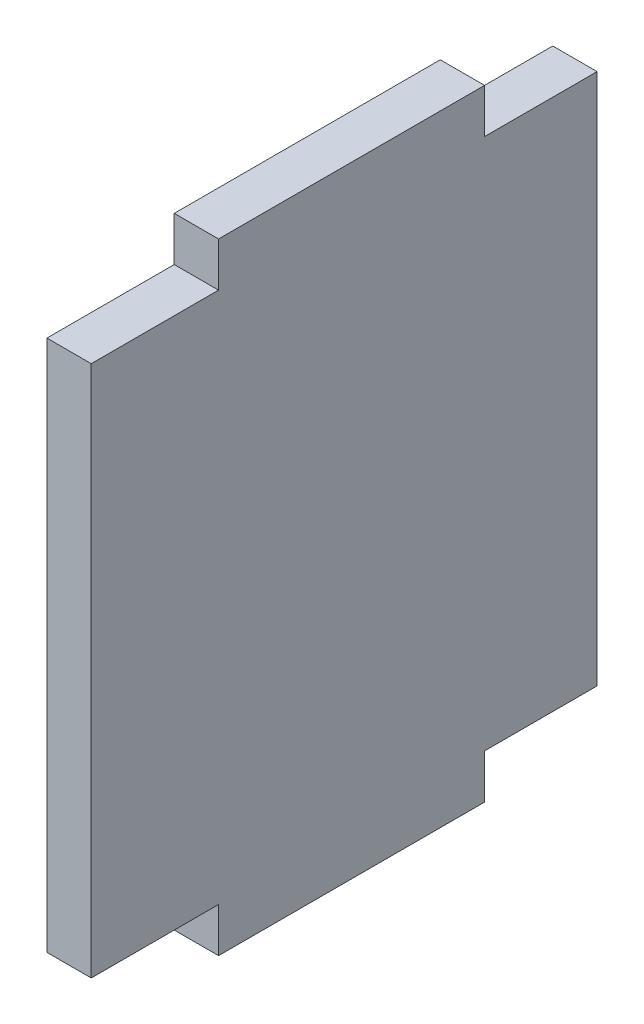
ISO-10303-21;
HEADER;
FILE_DESCRIPTION(('STEP AP214'),'2;1');
FILE_NAME('part.step','',(''),(''),'','','');
FILE_SCHEMA(('AUTOMOTIVE_DESIGN { 1 0 10303 214 1 1 1 1 }'));
ENDSEC;
DATA;
#1=APPLICATION_CONTEXT('core data for automotive mechanical design processes');
#2=APPLICATION_PROTOCOL_DEFINITION('international standard','automotive_design',2000,#1);
#3=PRODUCT_CONTEXT('',#1,'mechanical');
#4=PRODUCT('Part','Part','',(#3));
#5=PRODUCT_RELATED_PRODUCT_CATEGORY('part','',(#4));
#6=PRODUCT_DEFINITION_FORMATION('','',#4);
#7=PRODUCT_DEFINITION_CONTEXT('part definition',#1,'design');
#8=PRODUCT_DEFINITION('design','',#6,#7);
#9=PRODUCT_DEFINITION_SHAPE('','',#8);
#10=(LENGTH_UNIT() NAMED_UNIT(*) SI_UNIT(.MILLI.,.METRE.));
#11=(NAMED_UNIT(*) PLANE_ANGLE_UNIT() SI_UNIT($,.RADIAN.));
#12=(NAMED_UNIT(*) SI_UNIT($,.STERADIAN.) SOLID_ANGLE_UNIT());
#13=UNCERTAINTY_MEASURE_WITH_UNIT(LENGTH_MEASURE(1.E-05),#10,'distance_accuracy_value','');
#14=(GEOMETRIC_REPRESENTATION_CONTEXT(3) GLOBAL_UNCERTAINTY_ASSIGNED_CONTEXT((#13)) GLOBAL_UNIT_ASSIGNED_CONTEXT((#10,
#11,#12)) REPRESENTATION_CONTEXT('',''));
#15=CARTESIAN_POINT('',(0.,0.,0.));
#16=DIRECTION('',(0.,0.,1.));
#17=DIRECTION('',(1.,0.,0.));
#18=AXIS2_PLACEMENT_3D('',#15,#16,#17);
#19=CARTESIAN_POINT('',(1.25,15.,-6.85046433));
#20=DIRECTION('',(0.,-1.,0.));
#21=DIRECTION('',(0.,0.,-1.));
#22=AXIS2_PLACEMENT_3D('',#19,#20,#21);
#23=PLANE('',#22);
#24=DIRECTION('',(0.,0.,1.));
#25=VECTOR('',#24,1.);
#26=CARTESIAN_POINT('',(-1.25,15.,-6.85046433));
#27=LINE('',#26,#25);
#28=CARTESIAN_POINT('',(-1.25,15.,-13.195));
#29=VERTEX_POINT('',#28);
#30=CARTESIAN_POINT('',(-1.25,15.,-6.85046433));
#31=VERTEX_POINT('',#30);
#32=EDGE_CURVE('E164',#29,#31,#27,.T.);
#33=ORIENTED_EDGE('',*,*,#32,.T.);
#34=DIRECTION('',(-1.,0.,0.));
#35=VECTOR('',#34,1.);
#36=CARTESIAN_POINT('',(1.25,15.,-6.85046433));
#37=LINE('',#36,#35);
#38=CARTESIAN_POINT('',(1.25,15.,-6.85046433));
#39=VERTEX_POINT('',#38);
#40=EDGE_CURVE('E11',#39,#31,#37,.T.);
#41=ORIENTED_EDGE('',*,*,#40,.F.);
#42=DIRECTION('',(0.,0.,1.));
#43=VECTOR('',#42,1.);
#44=CARTESIAN_POINT('',(1.25,15.,-6.85046433));
#45=LINE('',#44,#43);
#46=CARTESIAN_POINT('',(1.25,15.,-13.195));
#47=VERTEX_POINT('',#46);
#48=EDGE_CURVE('E198',#47,#39,#45,.T.);
#49=ORIENTED_EDGE('',*,*,#48,.F.);
#50=DIRECTION('',(-1.,0.,0.));
#51=VECTOR('',#50,1.);
#52=CARTESIAN_POINT('',(1.25,15.,-13.195));
#53=LINE('',#52,#51);
#54=EDGE_CURVE('E160',#47,#29,#53,.T.);
#55=ORIENTED_EDGE('',*,*,#54,.T.);
#56=EDGE_LOOP('',(#33,#41,#49,#55));
#57=FACE_BOUND('',#56,.T.);
#58=ADVANCED_FACE('F39',(#57),#23,.F.);
#59=CARTESIAN_POINT('',(1.25,17.5,-6.85046433));
#60=DIRECTION('',(0.,0.,1.));
#61=DIRECTION('',(1.,0.,0.));
#62=AXIS2_PLACEMENT_3D('',#59,#60,#61);
#63=PLANE('',#62);
#64=DIRECTION('',(0.,1.,0.));
#65=VECTOR('',#64,1.);
#66=CARTESIAN_POINT('',(-1.25,17.5,-6.85046433));
#67=LINE('',#66,#65);
#68=CARTESIAN_POINT('',(-1.25,17.5,-6.85046433));
#69=VERTEX_POINT('',#68);
#70=EDGE_CURVE('E168',#31,#69,#67,.T.);
#71=ORIENTED_EDGE('',*,*,#70,.T.);
#72=DIRECTION('',(-1.,0.,0.));
#73=VECTOR('',#72,1.);
#74=CARTESIAN_POINT('',(1.25,17.5,-6.85046433));
#75=LINE('',#74,#73);
#76=CARTESIAN_POINT('',(1.25,17.5,-6.85046433));
#77=VERTEX_POINT('',#76);
#78=EDGE_CURVE('E48',#77,#69,#75,.T.);
#79=ORIENTED_EDGE('',*,*,#78,.F.);
#80=DIRECTION('',(0.,1.,0.));
#81=VECTOR('',#80,1.);
#82=CARTESIAN_POINT('',(1.25,17.5,-6.85046433));
#83=LINE('',#82,#81);
#84=EDGE_CURVE('E111',#39,#77,#83,.T.);
#85=ORIENTED_EDGE('',*,*,#84,.F.);
#86=ORIENTED_EDGE('',*,*,#40,.T.);
#87=EDGE_LOOP('',(#71,#79,#85,#86));
#88=FACE_BOUND('',#87,.T.);
#89=ADVANCED_FACE('F292',(#88),#63,.F.);
#90=CARTESIAN_POINT('',(1.25,17.5,8.14953567));
#91=DIRECTION('',(0.,-1.,0.));
#92=DIRECTION('',(0.,0.,-1.));
#93=AXIS2_PLACEMENT_3D('',#90,#91,#92);
#94=PLANE('',#93);
#95=DIRECTION('',(0.,0.,1.));
#96=VECTOR('',#95,1.);
#97=CARTESIAN_POINT('',(-1.25,17.5,8.14953567));
#98=LINE('',#97,#96);
#99=CARTESIAN_POINT('',(-1.25,17.5,8.14953567));
#100=VERTEX_POINT('',#99);
#101=EDGE_CURVE('E171',#69,#100,#98,.T.);
#102=ORIENTED_EDGE('',*,*,#101,.T.);
#103=DIRECTION('',(-1.,0.,0.));
#104=VECTOR('',#103,1.);
#105=CARTESIAN_POINT('',(1.25,17.5,8.14953567));
#106=LINE('',#105,#104);
#107=CARTESIAN_POINT('',(1.25,17.5,8.14953567));
#108=VERTEX_POINT('',#107);
#109=EDGE_CURVE('E225',#108,#100,#106,.T.);
#110=ORIENTED_EDGE('',*,*,#109,.F.);
#111=DIRECTION('',(0.,0.,1.));
#112=VECTOR('',#111,1.);
#113=CARTESIAN_POINT('',(1.25,17.5,8.14953567));
#114=LINE('',#113,#112);
#115=EDGE_CURVE('E235',#77,#108,#114,.T.);
#116=ORIENTED_EDGE('',*,*,#115,.F.);
#117=ORIENTED_EDGE('',*,*,#78,.T.);
#118=EDGE_LOOP('',(#102,#110,#116,#117));
#119=FACE_BOUND('',#118,.T.);
#120=ADVANCED_FACE('F233',(#119),#94,.F.);
#121=CARTESIAN_POINT('',(1.25,15.,8.14953567));
#122=DIRECTION('',(0.,0.,-1.));
#123=DIRECTION('',(-1.,0.,0.));
#124=AXIS2_PLACEMENT_3D('',#121,#122,#123);
#125=PLANE('',#124);
#126=DIRECTION('',(0.,-1.,0.));
#127=VECTOR('',#126,1.);
#128=CARTESIAN_POINT('',(-1.25,15.,8.14953567));
#129=LINE('',#128,#127);
#130=CARTESIAN_POINT('',(-1.25,15.,8.14953567));
#131=VERTEX_POINT('',#130);
#132=EDGE_CURVE('E174',#100,#131,#129,.T.);
#133=ORIENTED_EDGE('',*,*,#132,.T.);
#134=DIRECTION('',(-1.,0.,0.));
#135=VECTOR('',#134,1.);
#136=CARTESIAN_POINT('',(1.25,15.,8.14953567));
#137=LINE('',#136,#135);
#138=CARTESIAN_POINT('',(1.25,15.,8.14953567));
#139=VERTEX_POINT('',#138);
#140=EDGE_CURVE('E221',#139,#131,#137,.T.);
#141=ORIENTED_EDGE('',*,*,#140,.F.);
#142=DIRECTION('',(0.,-1.,0.));
#143=VECTOR('',#142,1.);
#144=CARTESIAN_POINT('',(1.25,15.,8.14953567));
#145=LINE('',#144,#143);
#146=EDGE_CURVE('E254',#108,#139,#145,.T.);
#147=ORIENTED_EDGE('',*,*,#146,.F.);
#148=ORIENTED_EDGE('',*,*,#109,.T.);
#149=EDGE_LOOP('',(#133,#141,#147,#148));
#150=FACE_BOUND('',#149,.T.);
#151=ADVANCED_FACE('F244',(#150),#125,.F.);
#152=CARTESIAN_POINT('',(1.25,15.,8.14953567));
#153=DIRECTION('',(0.,-1.,0.));
#154=DIRECTION('',(0.,0.,-1.));
#155=AXIS2_PLACEMENT_3D('',#152,#153,#154);
#156=PLANE('',#155);
#157=DIRECTION('',(0.,0.,1.));
#158=VECTOR('',#157,1.);
#159=CARTESIAN_POINT('',(-1.25,15.,8.14953567));
#160=LINE('',#159,#158);
#161=CARTESIAN_POINT('',(-1.25,15.,15.32953567));
#162=VERTEX_POINT('',#161);
#163=EDGE_CURVE('E177',#131,#162,#160,.T.);
#164=ORIENTED_EDGE('',*,*,#163,.T.);
#165=DIRECTION('',(-1.,0.,0.));
#166=VECTOR('',#165,1.);
#167=CARTESIAN_POINT('',(1.25,15.,15.32953567));
#168=LINE('',#167,#166);
#169=CARTESIAN_POINT('',(1.25,15.,15.32953567));
#170=VERTEX_POINT('',#169);
#171=EDGE_CURVE('E217',#170,#162,#168,.T.);
#172=ORIENTED_EDGE('',*,*,#171,.F.);
#173=DIRECTION('',(0.,0.,1.));
#174=VECTOR('',#173,1.);
#175=CARTESIAN_POINT('',(1.25,15.,8.14953567));
#176=LINE('',#175,#174);
#177=EDGE_CURVE('E250',#139,#170,#176,.T.);
#178=ORIENTED_EDGE('',*,*,#177,.F.);
#179=ORIENTED_EDGE('',*,*,#140,.T.);
#180=EDGE_LOOP('',(#164,#172,#178,#179));
#181=FACE_BOUND('',#180,.T.);
#182=ADVANCED_FACE('F248',(#181),#156,.F.);
#183=CARTESIAN_POINT('',(1.25,15.,15.32953567));
#184=DIRECTION('',(0.,0.,-1.));
#185=DIRECTION('',(0.,1.,0.));
#186=AXIS2_PLACEMENT_3D('',#183,#184,#185);
#187=PLANE('',#186);
#188=DIRECTION('',(0.,-1.,0.));
#189=VECTOR('',#188,1.);
#190=CARTESIAN_POINT('',(-1.25,15.,15.32953567));
#191=LINE('',#190,#189);
#192=CARTESIAN_POINT('',(-1.25,-15.,15.32953567));
#193=VERTEX_POINT('',#192);
#194=EDGE_CURVE('E180',#162,#193,#191,.T.);
#195=ORIENTED_EDGE('',*,*,#194,.T.);
#196=DIRECTION('',(-1.,0.,0.));
#197=VECTOR('',#196,1.);
#198=CARTESIAN_POINT('',(1.25,-15.,15.32953567));
#199=LINE('',#198,#197);
#200=CARTESIAN_POINT('',(1.25,-15.,15.32953567));
#201=VERTEX_POINT('',#200);
#202=EDGE_CURVE('E213',#201,#193,#199,.T.);
#203=ORIENTED_EDGE('',*,*,#202,.F.);
#204=DIRECTION('',(0.,-1.,0.));
#205=VECTOR('',#204,1.);
#206=CARTESIAN_POINT('',(1.25,15.,15.32953567));
#207=LINE('',#206,#205);
#208=EDGE_CURVE('E253',#170,#201,#207,.T.);
#209=ORIENTED_EDGE('',*,*,#208,.F.);
#210=ORIENTED_EDGE('',*,*,#171,.T.);
#211=EDGE_LOOP('',(#195,#203,#209,#210));
#212=FACE_BOUND('',#211,.T.);
#213=ADVANCED_FACE('F305',(#212),#187,.F.);
#214=CARTESIAN_POINT('',(1.25,-15.,15.32953567));
#215=DIRECTION('',(0.,1.,0.));
#216=DIRECTION('',(0.,0.,1.));
#217=AXIS2_PLACEMENT_3D('',#214,#215,#216);
#218=PLANE('',#217);
#219=DIRECTION('',(0.,0.,-1.));
#220=VECTOR('',#219,1.);
#221=CARTESIAN_POINT('',(-1.25,-15.,15.32953567));
#222=LINE('',#221,#220);
#223=CARTESIAN_POINT('',(-1.25,-15.,8.14953567));
#224=VERTEX_POINT('',#223);
#225=EDGE_CURVE('E183',#193,#224,#222,.T.);
#226=ORIENTED_EDGE('',*,*,#225,.T.);
#227=DIRECTION('',(-1.,0.,0.));
#228=VECTOR('',#227,1.);
#229=CARTESIAN_POINT('',(1.25,-15.,8.14953567));
#230=LINE('',#229,#228);
#231=CARTESIAN_POINT('',(1.25,-15.,8.14953567));
#232=VERTEX_POINT('',#231);
#233=EDGE_CURVE('E209',#232,#224,#230,.T.);
#234=ORIENTED_EDGE('',*,*,#233,.F.);
#235=DIRECTION('',(0.,0.,-1.));
#236=VECTOR('',#235,1.);
#237=CARTESIAN_POINT('',(1.25,-15.,15.32953567));
#238=LINE('',#237,#236);
#239=EDGE_CURVE('E258',#201,#232,#238,.T.);
#240=ORIENTED_EDGE('',*,*,#239,.F.);
#241=ORIENTED_EDGE('',*,*,#202,.T.);
#242=EDGE_LOOP('',(#226,#234,#240,#241));
#243=FACE_BOUND('',#242,.T.);
#244=ADVANCED_FACE('F308',(#243),#218,.F.);
#245=CARTESIAN_POINT('',(1.25,-15.,8.14953567));
#246=DIRECTION('',(0.,0.,-1.));
#247=DIRECTION('',(-1.,0.,0.));
#248=AXIS2_PLACEMENT_3D('',#245,#246,#247);
#249=PLANE('',#248);
#250=DIRECTION('',(0.,-1.,0.));
#251=VECTOR('',#250,1.);
#252=CARTESIAN_POINT('',(-1.25,-15.,8.14953567));
#253=LINE('',#252,#251);
#254=CARTESIAN_POINT('',(-1.25,-17.5,8.14953567));
#255=VERTEX_POINT('',#254);
#256=EDGE_CURVE('E186',#224,#255,#253,.T.);
#257=ORIENTED_EDGE('',*,*,#256,.T.);
#258=DIRECTION('',(-1.,0.,0.));
#259=VECTOR('',#258,1.);
#260=CARTESIAN_POINT('',(1.25,-17.5,8.14953567));
#261=LINE('',#260,#259);
#262=CARTESIAN_POINT('',(1.25,-17.5,8.14953567));
#263=VERTEX_POINT('',#262);
#264=EDGE_CURVE('E205',#263,#255,#261,.T.);
#265=ORIENTED_EDGE('',*,*,#264,.F.);
#266=DIRECTION('',(0.,-1.,0.));
#267=VECTOR('',#266,1.);
#268=CARTESIAN_POINT('',(1.25,-15.,8.14953567));
#269=LINE('',#268,#267);
#270=EDGE_CURVE('E265',#232,#263,#269,.T.);
#271=ORIENTED_EDGE('',*,*,#270,.F.);
#272=ORIENTED_EDGE('',*,*,#233,.T.);
#273=EDGE_LOOP('',(#257,#265,#271,#272));
#274=FACE_BOUND('',#273,.T.);
#275=ADVANCED_FACE('F273',(#274),#249,.F.);
#276=CARTESIAN_POINT('',(1.25,-17.5,8.14953567));
#277=DIRECTION('',(0.,1.,0.));
#278=DIRECTION('',(0.,0.,1.));
#279=AXIS2_PLACEMENT_3D('',#276,#277,#278);
#280=PLANE('',#279);
#281=DIRECTION('',(0.,0.,-1.));
#282=VECTOR('',#281,1.);
#283=CARTESIAN_POINT('',(-1.25,-17.5,8.14953567));
#284=LINE('',#283,#282);
#285=CARTESIAN_POINT('',(-1.25,-17.5,-6.85046433));
#286=VERTEX_POINT('',#285);
#287=EDGE_CURVE('E189',#255,#286,#284,.T.);
#288=ORIENTED_EDGE('',*,*,#287,.T.);
#289=DIRECTION('',(-1.,0.,0.));
#290=VECTOR('',#289,1.);
#291=CARTESIAN_POINT('',(1.25,-17.5,-6.85046433));
#292=LINE('',#291,#290);
#293=CARTESIAN_POINT('',(1.25,-17.5,-6.85046433));
#294=VERTEX_POINT('',#293);
#295=EDGE_CURVE('E153',#294,#286,#292,.T.);
#296=ORIENTED_EDGE('',*,*,#295,.F.);
#297=DIRECTION('',(0.,0.,-1.));
#298=VECTOR('',#297,1.);
#299=CARTESIAN_POINT('',(1.25,-17.5,8.14953567));
#300=LINE('',#299,#298);
#301=EDGE_CURVE('E142',#263,#294,#300,.T.);
#302=ORIENTED_EDGE('',*,*,#301,.F.);
#303=ORIENTED_EDGE('',*,*,#264,.T.);
#304=EDGE_LOOP('',(#288,#296,#302,#303));
#305=FACE_BOUND('',#304,.T.);
#306=ADVANCED_FACE('F277',(#305),#280,.F.);
#307=CARTESIAN_POINT('',(1.25,-17.5,-6.85046433));
#308=DIRECTION('',(0.,0.,1.));
#309=DIRECTION('',(1.,0.,0.));
#310=AXIS2_PLACEMENT_3D('',#307,#308,#309);
#311=PLANE('',#310);
#312=DIRECTION('',(0.,1.,0.));
#313=VECTOR('',#312,1.);
#314=CARTESIAN_POINT('',(-1.25,-17.5,-6.85046433));
#315=LINE('',#314,#313);
#316=CARTESIAN_POINT('',(-1.25,-15.,-6.85046433));
#317=VERTEX_POINT('',#316);
#318=EDGE_CURVE('E151',#286,#317,#315,.T.);
#319=ORIENTED_EDGE('',*,*,#318,.T.);
#320=DIRECTION('',(-1.,0.,0.));
#321=VECTOR('',#320,1.);
#322=CARTESIAN_POINT('',(1.25,-15.,-6.85046433));
#323=LINE('',#322,#321);
#324=CARTESIAN_POINT('',(1.25,-15.,-6.85046433));
#325=VERTEX_POINT('',#324);
#326=EDGE_CURVE('E148',#325,#317,#323,.T.);
#327=ORIENTED_EDGE('',*,*,#326,.F.);
#328=DIRECTION('',(0.,1.,0.));
#329=VECTOR('',#328,1.);
#330=CARTESIAN_POINT('',(1.25,-17.5,-6.85046433));
#331=LINE('',#330,#329);
#332=EDGE_CURVE('E136',#294,#325,#331,.T.);
#333=ORIENTED_EDGE('',*,*,#332,.F.);
#334=ORIENTED_EDGE('',*,*,#295,.T.);
#335=EDGE_LOOP('',(#319,#327,#333,#334));
#336=FACE_BOUND('',#335,.T.);
#337=ADVANCED_FACE('F149',(#336),#311,.F.);
#338=CARTESIAN_POINT('',(1.25,-15.,-6.85046433));
#339=DIRECTION('',(0.,1.,0.));
#340=DIRECTION('',(0.,0.,1.));
#341=AXIS2_PLACEMENT_3D('',#338,#339,#340);
#342=PLANE('',#341);
#343=DIRECTION('',(0.,0.,-1.));
#344=VECTOR('',#343,1.);
#345=CARTESIAN_POINT('',(-1.25,-15.,-6.85046433));
#346=LINE('',#345,#344);
#347=CARTESIAN_POINT('',(-1.25,-15.,-13.195));
#348=VERTEX_POINT('',#347);
#349=EDGE_CURVE('E97',#317,#348,#346,.T.);
#350=ORIENTED_EDGE('',*,*,#349,.T.);
#351=DIRECTION('',(-1.,0.,0.));
#352=VECTOR('',#351,1.);
#353=CARTESIAN_POINT('',(1.25,-15.,-13.195));
#354=LINE('',#353,#352);
#355=CARTESIAN_POINT('',(1.25,-15.,-13.195));
#356=VERTEX_POINT('',#355);
#357=EDGE_CURVE('E154',#356,#348,#354,.T.);
#358=ORIENTED_EDGE('',*,*,#357,.F.);
#359=DIRECTION('',(0.,0.,-1.));
#360=VECTOR('',#359,1.);
#361=CARTESIAN_POINT('',(1.25,-15.,-6.85046433));
#362=LINE('',#361,#360);
#363=EDGE_CURVE('E140',#325,#356,#362,.T.);
#364=ORIENTED_EDGE('',*,*,#363,.F.);
#365=ORIENTED_EDGE('',*,*,#326,.T.);
#366=EDGE_LOOP('',(#350,#358,#364,#365));
#367=FACE_BOUND('',#366,.T.);
#368=ADVANCED_FACE('F156',(#367),#342,.F.);
#369=CARTESIAN_POINT('',(1.25,-15.,-13.195));
#370=DIRECTION('',(0.,0.,1.));
#371=DIRECTION('',(1.,0.,0.));
#372=AXIS2_PLACEMENT_3D('',#369,#370,#371);
#373=PLANE('',#372);
#374=DIRECTION('',(0.,1.,0.));
#375=VECTOR('',#374,1.);
#376=CARTESIAN_POINT('',(-1.25,-15.,-13.195));
#377=LINE('',#376,#375);
#378=EDGE_CURVE('E103',#348,#29,#377,.T.);
#379=ORIENTED_EDGE('',*,*,#378,.T.);
#380=ORIENTED_EDGE('',*,*,#54,.F.);
#381=DIRECTION('',(0.,1.,0.));
#382=VECTOR('',#381,1.);
#383=CARTESIAN_POINT('',(1.25,-15.,-13.195));
#384=LINE('',#383,#382);
#385=EDGE_CURVE('E56',#356,#47,#384,.T.);
#386=ORIENTED_EDGE('',*,*,#385,.F.);
#387=ORIENTED_EDGE('',*,*,#357,.T.);
#388=EDGE_LOOP('',(#379,#380,#386,#387));
#389=FACE_BOUND('',#388,.T.);
#390=ADVANCED_FACE('F281',(#389),#373,.F.);
#391=CARTESIAN_POINT('',(1.25,0.,0.));
#392=DIRECTION('',(1.,0.,0.));
#393=DIRECTION('',(0.,0.,-1.));
#394=AXIS2_PLACEMENT_3D('',#391,#392,#393);
#395=PLANE('',#394);
#396=ORIENTED_EDGE('',*,*,#48,.T.);
#397=ORIENTED_EDGE('',*,*,#84,.T.);
#398=ORIENTED_EDGE('',*,*,#115,.T.);
#399=ORIENTED_EDGE('',*,*,#146,.T.);
#400=ORIENTED_EDGE('',*,*,#177,.T.);
#401=ORIENTED_EDGE('',*,*,#208,.T.);
#402=ORIENTED_EDGE('',*,*,#239,.T.);
#403=ORIENTED_EDGE('',*,*,#270,.T.);
#404=ORIENTED_EDGE('',*,*,#301,.T.);
#405=ORIENTED_EDGE('',*,*,#332,.T.);
#406=ORIENTED_EDGE('',*,*,#363,.T.);
#407=ORIENTED_EDGE('',*,*,#385,.T.);
#408=EDGE_LOOP('',(#396,#397,#398,#399,#400,#401,#402,#403,#404,#405,#406,#407));
#409=FACE_BOUND('',#408,.T.);
#410=ADVANCED_FACE('F138',(#409),#395,.T.);
#411=CARTESIAN_POINT('',(-1.25,0.,0.));
#412=DIRECTION('',(1.,0.,0.));
#413=DIRECTION('',(0.,0.,-1.));
#414=AXIS2_PLACEMENT_3D('',#411,#412,#413);
#415=PLANE('',#414);
#416=ORIENTED_EDGE('',*,*,#32,.F.);
#417=ORIENTED_EDGE('',*,*,#378,.F.);
#418=ORIENTED_EDGE('',*,*,#349,.F.);
#419=ORIENTED_EDGE('',*,*,#318,.F.);
#420=ORIENTED_EDGE('',*,*,#287,.F.);
#421=ORIENTED_EDGE('',*,*,#256,.F.);
#422=ORIENTED_EDGE('',*,*,#225,.F.);
#423=ORIENTED_EDGE('',*,*,#194,.F.);
#424=ORIENTED_EDGE('',*,*,#163,.F.);
#425=ORIENTED_EDGE('',*,*,#132,.F.);
#426=ORIENTED_EDGE('',*,*,#101,.F.);
#427=ORIENTED_EDGE('',*,*,#70,.F.);
#428=EDGE_LOOP('',(#416,#417,#418,#419,#420,#421,#422,#423,#424,#425,#426,#427));
#429=FACE_BOUND('',#428,.T.);
#430=ADVANCED_FACE('F239',(#429),#415,.F.);
#431=CLOSED_SHELL('',(#58,#89,#120,#151,#182,#213,#244,#275,#306,#337,#368,#390,#410,#430));
#432=MANIFOLD_SOLID_BREP('B2',#431);
#433=ADVANCED_BREP_SHAPE_REPRESENTATION('',(#18,#432),#14);
#434=SHAPE_DEFINITION_REPRESENTATION(#9,#433);
ENDSEC;
END-ISO-10303-21;
